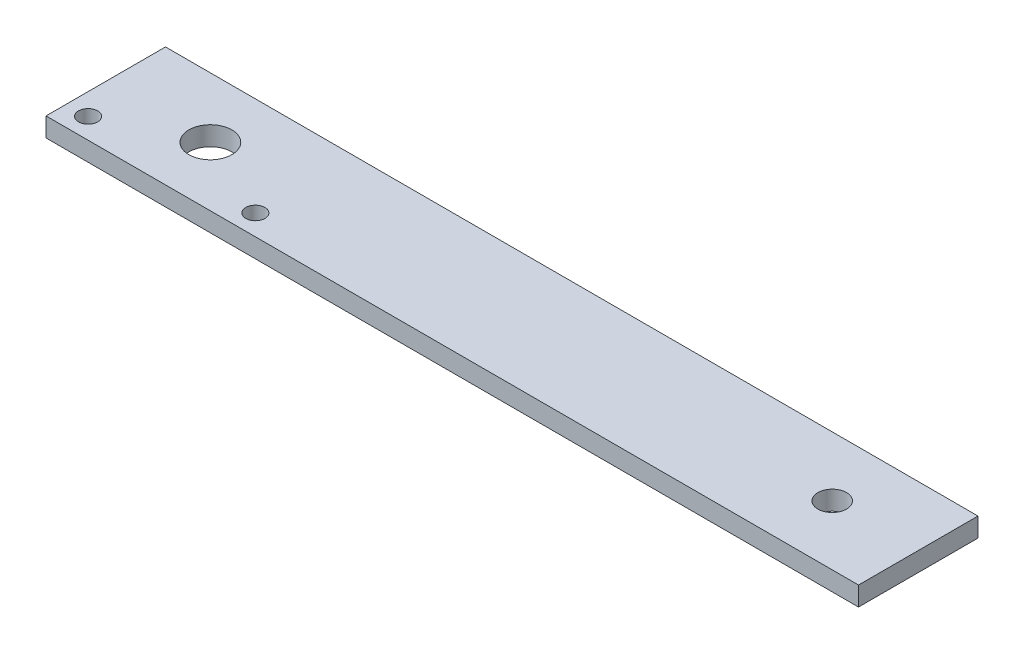
ISO-10303-21;
HEADER;
FILE_DESCRIPTION(('STEP AP214'),'2;1');
FILE_NAME('part.step','',(''),(''),'','','');
FILE_SCHEMA(('AUTOMOTIVE_DESIGN { 1 0 10303 214 1 1 1 1 }'));
ENDSEC;
DATA;
#1=APPLICATION_CONTEXT('core data for automotive mechanical design processes');
#2=APPLICATION_PROTOCOL_DEFINITION('international standard','automotive_design',2000,#1);
#3=PRODUCT_CONTEXT('',#1,'mechanical');
#4=PRODUCT('Part','Part','',(#3));
#5=PRODUCT_RELATED_PRODUCT_CATEGORY('part','',(#4));
#6=PRODUCT_DEFINITION_FORMATION('','',#4);
#7=PRODUCT_DEFINITION_CONTEXT('part definition',#1,'design');
#8=PRODUCT_DEFINITION('design','',#6,#7);
#9=PRODUCT_DEFINITION_SHAPE('','',#8);
#10=(LENGTH_UNIT() NAMED_UNIT(*) SI_UNIT(.MILLI.,.METRE.));
#11=(NAMED_UNIT(*) PLANE_ANGLE_UNIT() SI_UNIT($,.RADIAN.));
#12=(NAMED_UNIT(*) SI_UNIT($,.STERADIAN.) SOLID_ANGLE_UNIT());
#13=UNCERTAINTY_MEASURE_WITH_UNIT(LENGTH_MEASURE(1.E-05),#10,'distance_accuracy_value','');
#14=(GEOMETRIC_REPRESENTATION_CONTEXT(3) GLOBAL_UNCERTAINTY_ASSIGNED_CONTEXT((#13)) GLOBAL_UNIT_ASSIGNED_CONTEXT((#10,
#11,#12)) REPRESENTATION_CONTEXT('',''));
#15=CARTESIAN_POINT('',(0.,0.,0.));
#16=DIRECTION('',(0.,0.,1.));
#17=DIRECTION('',(1.,0.,0.));
#18=AXIS2_PLACEMENT_3D('',#15,#16,#17);
#19=CARTESIAN_POINT('',(-85.,4.,0.));
#20=DIRECTION('',(1.,0.,0.));
#21=DIRECTION('',(0.,0.,-1.));
#22=AXIS2_PLACEMENT_3D('',#19,#20,#21);
#23=PLANE('',#22);
#24=DIRECTION('',(0.,0.,1.));
#25=VECTOR('',#24,1.);
#26=CARTESIAN_POINT('',(-85.,0.,0.));
#27=LINE('',#26,#25);
#28=CARTESIAN_POINT('',(-85.,0.,-12.5));
#29=VERTEX_POINT('',#28);
#30=CARTESIAN_POINT('',(-85.,0.,12.5));
#31=VERTEX_POINT('',#30);
#32=EDGE_CURVE('E127',#29,#31,#27,.T.);
#33=ORIENTED_EDGE('',*,*,#32,.T.);
#34=DIRECTION('',(0.,-1.,0.));
#35=VECTOR('',#34,1.);
#36=CARTESIAN_POINT('',(-85.,4.,12.5));
#37=LINE('',#36,#35);
#38=CARTESIAN_POINT('',(-85.,4.,12.5));
#39=VERTEX_POINT('',#38);
#40=EDGE_CURVE('E11',#39,#31,#37,.T.);
#41=ORIENTED_EDGE('',*,*,#40,.F.);
#42=DIRECTION('',(0.,0.,1.));
#43=VECTOR('',#42,1.);
#44=CARTESIAN_POINT('',(-85.,4.,0.));
#45=LINE('',#44,#43);
#46=CARTESIAN_POINT('',(-85.,4.,-12.5));
#47=VERTEX_POINT('',#46);
#48=EDGE_CURVE('E93',#47,#39,#45,.T.);
#49=ORIENTED_EDGE('',*,*,#48,.F.);
#50=DIRECTION('',(0.,-1.,0.));
#51=VECTOR('',#50,1.);
#52=CARTESIAN_POINT('',(-85.,4.,-12.5));
#53=LINE('',#52,#51);
#54=EDGE_CURVE('E59',#47,#29,#53,.T.);
#55=ORIENTED_EDGE('',*,*,#54,.T.);
#56=EDGE_LOOP('',(#33,#41,#49,#55));
#57=FACE_BOUND('',#56,.T.);
#58=ADVANCED_FACE('F41',(#57),#23,.F.);
#59=CARTESIAN_POINT('',(0.,4.,12.5));
#60=DIRECTION('',(0.,0.,-1.));
#61=DIRECTION('',(-1.,0.,0.));
#62=AXIS2_PLACEMENT_3D('',#59,#60,#61);
#63=PLANE('',#62);
#64=DIRECTION('',(1.,0.,0.));
#65=VECTOR('',#64,1.);
#66=CARTESIAN_POINT('',(0.,0.,12.5));
#67=LINE('',#66,#65);
#68=CARTESIAN_POINT('',(85.,0.,12.5));
#69=VERTEX_POINT('',#68);
#70=EDGE_CURVE('E99',#31,#69,#67,.T.);
#71=ORIENTED_EDGE('',*,*,#70,.T.);
#72=DIRECTION('',(0.,-1.,0.));
#73=VECTOR('',#72,1.);
#74=CARTESIAN_POINT('',(85.,4.,12.5));
#75=LINE('',#74,#73);
#76=CARTESIAN_POINT('',(85.,4.,12.5));
#77=VERTEX_POINT('',#76);
#78=EDGE_CURVE('E51',#77,#69,#75,.T.);
#79=ORIENTED_EDGE('',*,*,#78,.F.);
#80=DIRECTION('',(1.,0.,0.));
#81=VECTOR('',#80,1.);
#82=CARTESIAN_POINT('',(0.,4.,12.5));
#83=LINE('',#82,#81);
#84=EDGE_CURVE('E84',#39,#77,#83,.T.);
#85=ORIENTED_EDGE('',*,*,#84,.F.);
#86=ORIENTED_EDGE('',*,*,#40,.T.);
#87=EDGE_LOOP('',(#71,#79,#85,#86));
#88=FACE_BOUND('',#87,.T.);
#89=ADVANCED_FACE('F98',(#88),#63,.F.);
#90=CARTESIAN_POINT('',(85.,4.,0.));
#91=DIRECTION('',(1.,0.,0.));
#92=DIRECTION('',(0.,0.,-1.));
#93=AXIS2_PLACEMENT_3D('',#90,#91,#92);
#94=PLANE('',#93);
#95=DIRECTION('',(0.,0.,1.));
#96=VECTOR('',#95,1.);
#97=CARTESIAN_POINT('',(85.,0.,0.));
#98=LINE('',#97,#96);
#99=CARTESIAN_POINT('',(85.,0.,-12.5));
#100=VERTEX_POINT('',#99);
#101=EDGE_CURVE('E132',#100,#69,#98,.T.);
#102=ORIENTED_EDGE('',*,*,#101,.F.);
#103=DIRECTION('',(0.,-1.,0.));
#104=VECTOR('',#103,1.);
#105=CARTESIAN_POINT('',(85.,4.,-12.5));
#106=LINE('',#105,#104);
#107=CARTESIAN_POINT('',(85.,4.,-12.5));
#108=VERTEX_POINT('',#107);
#109=EDGE_CURVE('E73',#108,#100,#106,.T.);
#110=ORIENTED_EDGE('',*,*,#109,.F.);
#111=DIRECTION('',(0.,0.,1.));
#112=VECTOR('',#111,1.);
#113=CARTESIAN_POINT('',(85.,4.,0.));
#114=LINE('',#113,#112);
#115=EDGE_CURVE('E92',#108,#77,#114,.T.);
#116=ORIENTED_EDGE('',*,*,#115,.T.);
#117=ORIENTED_EDGE('',*,*,#78,.T.);
#118=EDGE_LOOP('',(#102,#110,#116,#117));
#119=FACE_BOUND('',#118,.T.);
#120=ADVANCED_FACE('F103',(#119),#94,.T.);
#121=CARTESIAN_POINT('',(0.,4.,-12.5));
#122=DIRECTION('',(0.,0.,-1.));
#123=DIRECTION('',(-1.,0.,0.));
#124=AXIS2_PLACEMENT_3D('',#121,#122,#123);
#125=PLANE('',#124);
#126=DIRECTION('',(1.,0.,0.));
#127=VECTOR('',#126,1.);
#128=CARTESIAN_POINT('',(0.,0.,-12.5));
#129=LINE('',#128,#127);
#130=EDGE_CURVE('E135',#29,#100,#129,.T.);
#131=ORIENTED_EDGE('',*,*,#130,.F.);
#132=ORIENTED_EDGE('',*,*,#54,.F.);
#133=DIRECTION('',(1.,0.,0.));
#134=VECTOR('',#133,1.);
#135=CARTESIAN_POINT('',(0.,4.,-12.5));
#136=LINE('',#135,#134);
#137=EDGE_CURVE('E105',#47,#108,#136,.T.);
#138=ORIENTED_EDGE('',*,*,#137,.T.);
#139=ORIENTED_EDGE('',*,*,#109,.T.);
#140=EDGE_LOOP('',(#131,#132,#138,#139));
#141=FACE_BOUND('',#140,.T.);
#142=ADVANCED_FACE('F192',(#141),#125,.T.);
#143=CARTESIAN_POINT('',(-80.5094955041935,4.,8.18274522102321));
#144=DIRECTION('',(0.,-1.,0.));
#145=DIRECTION('',(0.,0.,-1.));
#146=AXIS2_PLACEMENT_3D('',#143,#144,#145);
#147=CYLINDRICAL_SURFACE('',#146,2.);
#148=CARTESIAN_POINT('',(-80.5094955041935,4.,8.18274522102321));
#149=DIRECTION('',(0.,1.,0.));
#150=DIRECTION('',(0.,0.,1.));
#151=AXIS2_PLACEMENT_3D('',#148,#149,#150);
#152=CIRCLE('',#151,2.);
#153=CARTESIAN_POINT('',(-80.5094955041935,4.,10.1827452210232));
#154=VERTEX_POINT('',#153);
#155=EDGE_CURVE('E157',#154,#154,#152,.T.);
#156=ORIENTED_EDGE('',*,*,#155,.T.);
#157=EDGE_LOOP('',(#156));
#158=FACE_BOUND('',#157,.T.);
#159=CARTESIAN_POINT('',(-80.5094955041935,0.,8.18274522102321));
#160=DIRECTION('',(0.,1.,0.));
#161=DIRECTION('',(0.,0.,1.));
#162=AXIS2_PLACEMENT_3D('',#159,#160,#161);
#163=CIRCLE('',#162,2.);
#164=CARTESIAN_POINT('',(-80.5094955041935,0.,10.1827452210232));
#165=VERTEX_POINT('',#164);
#166=EDGE_CURVE('E123',#165,#165,#163,.T.);
#167=ORIENTED_EDGE('',*,*,#166,.F.);
#168=EDGE_LOOP('',(#167));
#169=FACE_BOUND('',#168,.T.);
#170=ADVANCED_FACE('F165',(#158,#169),#147,.F.);
#171=CARTESIAN_POINT('',(-45.5094955041935,4.,8.18274522102318));
#172=DIRECTION('',(0.,-1.,0.));
#173=DIRECTION('',(0.,0.,-1.));
#174=AXIS2_PLACEMENT_3D('',#171,#172,#173);
#175=CYLINDRICAL_SURFACE('',#174,2.);
#176=CARTESIAN_POINT('',(-45.5094955041935,4.,8.18274522102318));
#177=DIRECTION('',(0.,1.,0.));
#178=DIRECTION('',(0.,0.,1.));
#179=AXIS2_PLACEMENT_3D('',#176,#177,#178);
#180=CIRCLE('',#179,2.);
#181=CARTESIAN_POINT('',(-45.5094955041935,4.,10.1827452210232));
#182=VERTEX_POINT('',#181);
#183=EDGE_CURVE('E151',#182,#182,#180,.T.);
#184=ORIENTED_EDGE('',*,*,#183,.T.);
#185=EDGE_LOOP('',(#184));
#186=FACE_BOUND('',#185,.T.);
#187=CARTESIAN_POINT('',(-45.5094955041935,0.,8.18274522102318));
#188=DIRECTION('',(0.,1.,0.));
#189=DIRECTION('',(0.,0.,1.));
#190=AXIS2_PLACEMENT_3D('',#187,#188,#189);
#191=CIRCLE('',#190,2.);
#192=CARTESIAN_POINT('',(-45.5094955041935,0.,10.1827452210232));
#193=VERTEX_POINT('',#192);
#194=EDGE_CURVE('E119',#193,#193,#191,.T.);
#195=ORIENTED_EDGE('',*,*,#194,.F.);
#196=EDGE_LOOP('',(#195));
#197=FACE_BOUND('',#196,.T.);
#198=ADVANCED_FACE('F191',(#186,#197),#175,.F.);
#199=CARTESIAN_POINT('',(67.,4.,0.));
#200=DIRECTION('',(0.,-1.,0.));
#201=DIRECTION('',(0.,0.,-1.));
#202=AXIS2_PLACEMENT_3D('',#199,#200,#201);
#203=CYLINDRICAL_SURFACE('',#202,3.00000000000001);
#204=CARTESIAN_POINT('',(67.,4.,0.));
#205=DIRECTION('',(0.,1.,0.));
#206=DIRECTION('',(0.,0.,1.));
#207=AXIS2_PLACEMENT_3D('',#204,#205,#206);
#208=CIRCLE('',#207,3.00000000000001);
#209=CARTESIAN_POINT('',(67.,4.,3.00000000000001));
#210=VERTEX_POINT('',#209);
#211=EDGE_CURVE('E143',#210,#210,#208,.T.);
#212=ORIENTED_EDGE('',*,*,#211,.T.);
#213=EDGE_LOOP('',(#212));
#214=FACE_BOUND('',#213,.T.);
#215=CARTESIAN_POINT('',(67.,0.,0.));
#216=DIRECTION('',(0.,1.,0.));
#217=DIRECTION('',(0.,0.,1.));
#218=AXIS2_PLACEMENT_3D('',#215,#216,#217);
#219=CIRCLE('',#218,3.00000000000001);
#220=CARTESIAN_POINT('',(67.,0.,3.00000000000001));
#221=VERTEX_POINT('',#220);
#222=EDGE_CURVE('E115',#221,#221,#219,.T.);
#223=ORIENTED_EDGE('',*,*,#222,.F.);
#224=EDGE_LOOP('',(#223));
#225=FACE_BOUND('',#224,.T.);
#226=ADVANCED_FACE('F43',(#214,#225),#203,.F.);
#227=CARTESIAN_POINT('',(-63.0311560164534,4.,0.0802017841280457));
#228=DIRECTION('',(0.,-1.,0.));
#229=DIRECTION('',(0.,0.,-1.));
#230=AXIS2_PLACEMENT_3D('',#227,#228,#229);
#231=CYLINDRICAL_SURFACE('',#230,4.5);
#232=CARTESIAN_POINT('',(-63.0311560164534,4.,0.0802017841280457));
#233=DIRECTION('',(0.,1.,0.));
#234=DIRECTION('',(0.,0.,1.));
#235=AXIS2_PLACEMENT_3D('',#232,#233,#234);
#236=CIRCLE('',#235,4.5);
#237=CARTESIAN_POINT('',(-63.0311560164534,4.,4.58020178412805));
#238=VERTEX_POINT('',#237);
#239=EDGE_CURVE('E108',#238,#238,#236,.T.);
#240=ORIENTED_EDGE('',*,*,#239,.T.);
#241=EDGE_LOOP('',(#240));
#242=FACE_BOUND('',#241,.T.);
#243=CARTESIAN_POINT('',(-63.0311560164534,0.,0.0802017841280457));
#244=DIRECTION('',(0.,1.,0.));
#245=DIRECTION('',(0.,0.,1.));
#246=AXIS2_PLACEMENT_3D('',#243,#244,#245);
#247=CIRCLE('',#246,4.5);
#248=CARTESIAN_POINT('',(-63.0311560164534,0.,4.58020178412805));
#249=VERTEX_POINT('',#248);
#250=EDGE_CURVE('E139',#249,#249,#247,.T.);
#251=ORIENTED_EDGE('',*,*,#250,.F.);
#252=EDGE_LOOP('',(#251));
#253=FACE_BOUND('',#252,.T.);
#254=ADVANCED_FACE('F170',(#242,#253),#231,.F.);
#255=CARTESIAN_POINT('',(0.,4.,0.));
#256=DIRECTION('',(0.,1.,0.));
#257=DIRECTION('',(0.,0.,1.));
#258=AXIS2_PLACEMENT_3D('',#255,#256,#257);
#259=PLANE('',#258);
#260=ORIENTED_EDGE('',*,*,#211,.F.);
#261=EDGE_LOOP('',(#260));
#262=FACE_BOUND('',#261,.T.);
#263=ORIENTED_EDGE('',*,*,#183,.F.);
#264=EDGE_LOOP('',(#263));
#265=FACE_BOUND('',#264,.T.);
#266=ORIENTED_EDGE('',*,*,#155,.F.);
#267=EDGE_LOOP('',(#266));
#268=FACE_BOUND('',#267,.T.);
#269=ORIENTED_EDGE('',*,*,#48,.T.);
#270=ORIENTED_EDGE('',*,*,#84,.T.);
#271=ORIENTED_EDGE('',*,*,#115,.F.);
#272=ORIENTED_EDGE('',*,*,#137,.F.);
#273=EDGE_LOOP('',(#269,#270,#271,#272));
#274=FACE_BOUND('',#273,.T.);
#275=ORIENTED_EDGE('',*,*,#239,.F.);
#276=EDGE_LOOP('',(#275));
#277=FACE_BOUND('',#276,.T.);
#278=ADVANCED_FACE('F88',(#262,#265,#268,#274,#277),#259,.T.);
#279=CARTESIAN_POINT('',(0.,0.,0.));
#280=DIRECTION('',(0.,1.,0.));
#281=DIRECTION('',(0.,0.,1.));
#282=AXIS2_PLACEMENT_3D('',#279,#280,#281);
#283=PLANE('',#282);
#284=ORIENTED_EDGE('',*,*,#222,.T.);
#285=EDGE_LOOP('',(#284));
#286=FACE_BOUND('',#285,.T.);
#287=ORIENTED_EDGE('',*,*,#194,.T.);
#288=EDGE_LOOP('',(#287));
#289=FACE_BOUND('',#288,.T.);
#290=ORIENTED_EDGE('',*,*,#166,.T.);
#291=EDGE_LOOP('',(#290));
#292=FACE_BOUND('',#291,.T.);
#293=ORIENTED_EDGE('',*,*,#32,.F.);
#294=ORIENTED_EDGE('',*,*,#130,.T.);
#295=ORIENTED_EDGE('',*,*,#101,.T.);
#296=ORIENTED_EDGE('',*,*,#70,.F.);
#297=EDGE_LOOP('',(#293,#294,#295,#296));
#298=FACE_BOUND('',#297,.T.);
#299=ORIENTED_EDGE('',*,*,#250,.T.);
#300=EDGE_LOOP('',(#299));
#301=FACE_BOUND('',#300,.T.);
#302=ADVANCED_FACE('F169',(#286,#289,#292,#298,#301),#283,.F.);
#303=CLOSED_SHELL('',(#58,#89,#120,#142,#170,#198,#226,#254,#278,#302));
#304=MANIFOLD_SOLID_BREP('B2',#303);
#305=ADVANCED_BREP_SHAPE_REPRESENTATION('',(#18,#304),#14);
#306=SHAPE_DEFINITION_REPRESENTATION(#9,#305);
ENDSEC;
END-ISO-10303-21;
